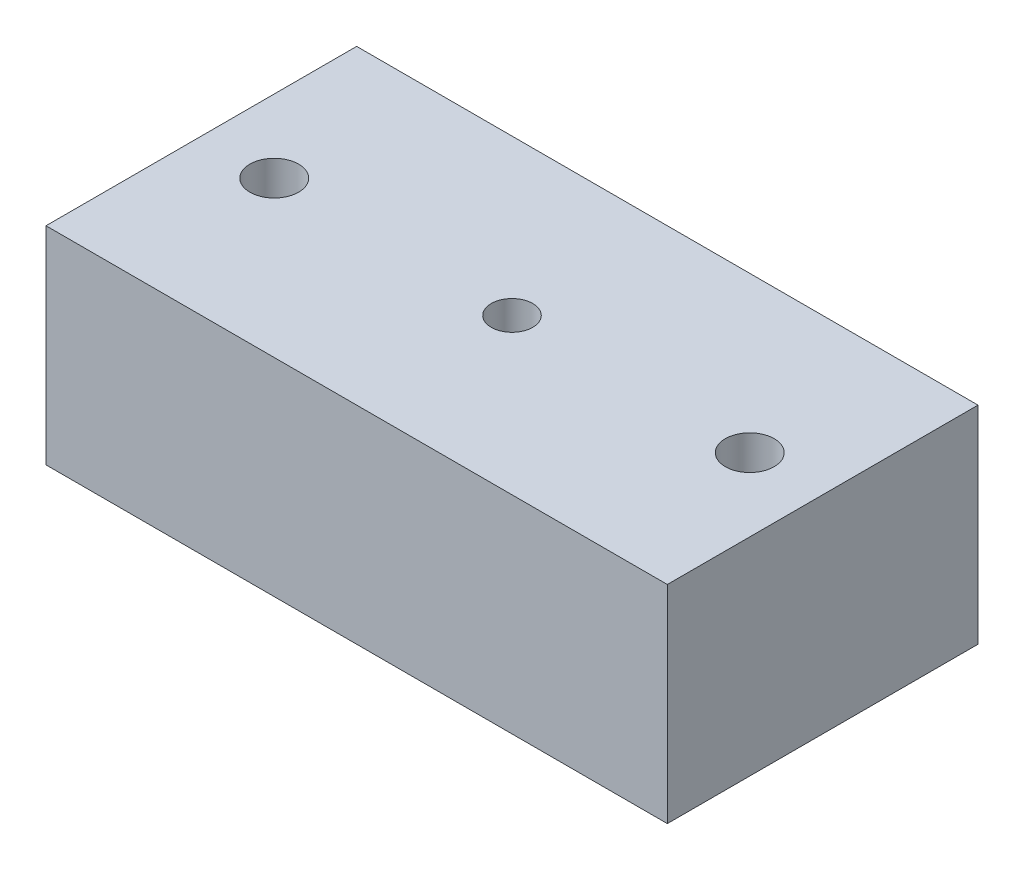
ISO-10303-21;
HEADER;
FILE_DESCRIPTION(('STEP AP214'),'2;1');
FILE_NAME('part.step','',(''),(''),'','','');
FILE_SCHEMA(('AUTOMOTIVE_DESIGN { 1 0 10303 214 1 1 1 1 }'));
ENDSEC;
DATA;
#1=APPLICATION_CONTEXT('core data for automotive mechanical design processes');
#2=APPLICATION_PROTOCOL_DEFINITION('international standard','automotive_design',2000,#1);
#3=PRODUCT_CONTEXT('',#1,'mechanical');
#4=PRODUCT('Part','Part','',(#3));
#5=PRODUCT_RELATED_PRODUCT_CATEGORY('part','',(#4));
#6=PRODUCT_DEFINITION_FORMATION('','',#4);
#7=PRODUCT_DEFINITION_CONTEXT('part definition',#1,'design');
#8=PRODUCT_DEFINITION('design','',#6,#7);
#9=PRODUCT_DEFINITION_SHAPE('','',#8);
#10=(LENGTH_UNIT() NAMED_UNIT(*) SI_UNIT(.MILLI.,.METRE.));
#11=(NAMED_UNIT(*) PLANE_ANGLE_UNIT() SI_UNIT($,.RADIAN.));
#12=(NAMED_UNIT(*) SI_UNIT($,.STERADIAN.) SOLID_ANGLE_UNIT());
#13=UNCERTAINTY_MEASURE_WITH_UNIT(LENGTH_MEASURE(1.E-05),#10,'distance_accuracy_value','');
#14=(GEOMETRIC_REPRESENTATION_CONTEXT(3) GLOBAL_UNCERTAINTY_ASSIGNED_CONTEXT((#13)) GLOBAL_UNIT_ASSIGNED_CONTEXT((#10,
#11,#12)) REPRESENTATION_CONTEXT('',''));
#15=CARTESIAN_POINT('',(0.,0.,0.));
#16=DIRECTION('',(0.,0.,1.));
#17=DIRECTION('',(1.,0.,0.));
#18=AXIS2_PLACEMENT_3D('',#15,#16,#17);
#19=CARTESIAN_POINT('',(0.,40.,0.));
#20=DIRECTION('',(0.,-1.,0.));
#21=DIRECTION('',(0.,0.,-1.));
#22=AXIS2_PLACEMENT_3D('',#19,#20,#21);
#23=PLANE('',#22);
#24=DIRECTION('',(0.,0.,-1.));
#25=VECTOR('',#24,1.);
#26=CARTESIAN_POINT('',(60.,40.,30.));
#27=LINE('',#26,#25);
#28=CARTESIAN_POINT('',(60.,40.,30.));
#29=VERTEX_POINT('',#28);
#30=CARTESIAN_POINT('',(60.,40.,-30.));
#31=VERTEX_POINT('',#30);
#32=EDGE_CURVE('E90',#29,#31,#27,.T.);
#33=ORIENTED_EDGE('',*,*,#32,.T.);
#34=DIRECTION('',(-1.,0.,0.));
#35=VECTOR('',#34,1.);
#36=CARTESIAN_POINT('',(-60.,40.,-30.));
#37=LINE('',#36,#35);
#38=CARTESIAN_POINT('',(-60.,40.,-30.));
#39=VERTEX_POINT('',#38);
#40=EDGE_CURVE('E85',#31,#39,#37,.T.);
#41=ORIENTED_EDGE('',*,*,#40,.T.);
#42=DIRECTION('',(0.,0.,1.));
#43=VECTOR('',#42,1.);
#44=CARTESIAN_POINT('',(-60.,40.,30.));
#45=LINE('',#44,#43);
#46=CARTESIAN_POINT('',(-60.,40.,30.));
#47=VERTEX_POINT('',#46);
#48=EDGE_CURVE('E88',#39,#47,#45,.T.);
#49=ORIENTED_EDGE('',*,*,#48,.T.);
#50=DIRECTION('',(1.,0.,0.));
#51=VECTOR('',#50,1.);
#52=CARTESIAN_POINT('',(-60.,40.,30.));
#53=LINE('',#52,#51);
#54=EDGE_CURVE('E55',#47,#29,#53,.T.);
#55=ORIENTED_EDGE('',*,*,#54,.T.);
#56=EDGE_LOOP('',(#33,#41,#49,#55));
#57=FACE_BOUND('',#56,.T.);
#58=CARTESIAN_POINT('',(0.,40.,0.));
#59=DIRECTION('',(0.,1.,0.));
#60=DIRECTION('',(0.,0.,1.));
#61=AXIS2_PLACEMENT_3D('',#58,#59,#60);
#62=CIRCLE('',#61,4.);
#63=CARTESIAN_POINT('',(0.,40.,4.));
#64=VERTEX_POINT('',#63);
#65=EDGE_CURVE('E105',#64,#64,#62,.T.);
#66=ORIENTED_EDGE('',*,*,#65,.F.);
#67=EDGE_LOOP('',(#66));
#68=FACE_BOUND('',#67,.T.);
#69=CARTESIAN_POINT('',(-45.9178121612938,40.,0.));
#70=DIRECTION('',(0.,1.,0.));
#71=DIRECTION('',(0.,0.,1.));
#72=AXIS2_PLACEMENT_3D('',#69,#70,#71);
#73=CIRCLE('',#72,4.70558735217259);
#74=CARTESIAN_POINT('',(-45.9178121612938,40.,4.70558735217259));
#75=VERTEX_POINT('',#74);
#76=EDGE_CURVE('E120',#75,#75,#73,.T.);
#77=ORIENTED_EDGE('',*,*,#76,.F.);
#78=EDGE_LOOP('',(#77));
#79=FACE_BOUND('',#78,.T.);
#80=CARTESIAN_POINT('',(45.9178121612938,40.,0.));
#81=DIRECTION('',(0.,1.,0.));
#82=DIRECTION('',(0.,0.,-1.));
#83=AXIS2_PLACEMENT_3D('',#80,#81,#82);
#84=CIRCLE('',#83,4.70558735217259);
#85=CARTESIAN_POINT('',(45.9178121612938,40.,-4.70558735217259));
#86=VERTEX_POINT('',#85);
#87=EDGE_CURVE('E126',#86,#86,#84,.T.);
#88=ORIENTED_EDGE('',*,*,#87,.F.);
#89=EDGE_LOOP('',(#88));
#90=FACE_BOUND('',#89,.T.);
#91=ADVANCED_FACE('F38',(#57,#68,#79,#90),#23,.F.);
#92=CARTESIAN_POINT('',(0.,0.,0.));
#93=DIRECTION('',(0.,-1.,0.));
#94=DIRECTION('',(0.,0.,-1.));
#95=AXIS2_PLACEMENT_3D('',#92,#93,#94);
#96=PLANE('',#95);
#97=CARTESIAN_POINT('',(-45.9178121612938,0.,0.));
#98=DIRECTION('',(0.,1.,0.));
#99=DIRECTION('',(0.,0.,1.));
#100=AXIS2_PLACEMENT_3D('',#97,#98,#99);
#101=CIRCLE('',#100,4.70558735217259);
#102=CARTESIAN_POINT('',(-45.9178121612938,0.,4.70558735217259));
#103=VERTEX_POINT('',#102);
#104=EDGE_CURVE('E123',#103,#103,#101,.T.);
#105=ORIENTED_EDGE('',*,*,#104,.T.);
#106=EDGE_LOOP('',(#105));
#107=FACE_BOUND('',#106,.T.);
#108=DIRECTION('',(0.,0.,-1.));
#109=VECTOR('',#108,1.);
#110=CARTESIAN_POINT('',(60.,0.,30.));
#111=LINE('',#110,#109);
#112=CARTESIAN_POINT('',(60.,0.,30.));
#113=VERTEX_POINT('',#112);
#114=CARTESIAN_POINT('',(60.,0.,-30.));
#115=VERTEX_POINT('',#114);
#116=EDGE_CURVE('E102',#113,#115,#111,.T.);
#117=ORIENTED_EDGE('',*,*,#116,.F.);
#118=DIRECTION('',(1.,0.,0.));
#119=VECTOR('',#118,1.);
#120=CARTESIAN_POINT('',(-60.,0.,30.));
#121=LINE('',#120,#119);
#122=CARTESIAN_POINT('',(-60.,0.,30.));
#123=VERTEX_POINT('',#122);
#124=EDGE_CURVE('E78',#123,#113,#121,.T.);
#125=ORIENTED_EDGE('',*,*,#124,.F.);
#126=DIRECTION('',(0.,0.,1.));
#127=VECTOR('',#126,1.);
#128=CARTESIAN_POINT('',(-60.,0.,30.));
#129=LINE('',#128,#127);
#130=CARTESIAN_POINT('',(-60.,0.,-30.));
#131=VERTEX_POINT('',#130);
#132=EDGE_CURVE('E72',#131,#123,#129,.T.);
#133=ORIENTED_EDGE('',*,*,#132,.F.);
#134=DIRECTION('',(-1.,0.,0.));
#135=VECTOR('',#134,1.);
#136=CARTESIAN_POINT('',(-60.,0.,-30.));
#137=LINE('',#136,#135);
#138=EDGE_CURVE('E94',#115,#131,#137,.T.);
#139=ORIENTED_EDGE('',*,*,#138,.F.);
#140=EDGE_LOOP('',(#117,#125,#133,#139));
#141=FACE_BOUND('',#140,.T.);
#142=CARTESIAN_POINT('',(0.,0.,0.));
#143=DIRECTION('',(0.,1.,0.));
#144=DIRECTION('',(0.,0.,1.));
#145=AXIS2_PLACEMENT_3D('',#142,#143,#144);
#146=CIRCLE('',#145,4.);
#147=CARTESIAN_POINT('',(0.,0.,4.));
#148=VERTEX_POINT('',#147);
#149=EDGE_CURVE('E117',#148,#148,#146,.T.);
#150=ORIENTED_EDGE('',*,*,#149,.T.);
#151=EDGE_LOOP('',(#150));
#152=FACE_BOUND('',#151,.T.);
#153=CARTESIAN_POINT('',(45.9178121612938,0.,0.));
#154=DIRECTION('',(0.,1.,0.));
#155=DIRECTION('',(0.,0.,-1.));
#156=AXIS2_PLACEMENT_3D('',#153,#154,#155);
#157=CIRCLE('',#156,4.70558735217259);
#158=CARTESIAN_POINT('',(45.9178121612938,0.,-4.70558735217259));
#159=VERTEX_POINT('',#158);
#160=EDGE_CURVE('E129',#159,#159,#157,.T.);
#161=ORIENTED_EDGE('',*,*,#160,.T.);
#162=EDGE_LOOP('',(#161));
#163=FACE_BOUND('',#162,.T.);
#164=ADVANCED_FACE('F113',(#107,#141,#152,#163),#96,.T.);
#165=CARTESIAN_POINT('',(60.,40.,30.));
#166=DIRECTION('',(-1.,0.,0.));
#167=DIRECTION('',(0.,0.,1.));
#168=AXIS2_PLACEMENT_3D('',#165,#166,#167);
#169=PLANE('',#168);
#170=ORIENTED_EDGE('',*,*,#116,.T.);
#171=DIRECTION('',(0.,-1.,0.));
#172=VECTOR('',#171,1.);
#173=CARTESIAN_POINT('',(60.,40.,-30.));
#174=LINE('',#173,#172);
#175=EDGE_CURVE('E11',#31,#115,#174,.T.);
#176=ORIENTED_EDGE('',*,*,#175,.F.);
#177=ORIENTED_EDGE('',*,*,#32,.F.);
#178=DIRECTION('',(0.,-1.,0.));
#179=VECTOR('',#178,1.);
#180=CARTESIAN_POINT('',(60.,40.,30.));
#181=LINE('',#180,#179);
#182=EDGE_CURVE('E98',#29,#113,#181,.T.);
#183=ORIENTED_EDGE('',*,*,#182,.T.);
#184=EDGE_LOOP('',(#170,#176,#177,#183));
#185=FACE_BOUND('',#184,.T.);
#186=ADVANCED_FACE('F40',(#185),#169,.F.);
#187=CARTESIAN_POINT('',(-60.,40.,-30.));
#188=DIRECTION('',(0.,0.,1.));
#189=DIRECTION('',(1.,0.,0.));
#190=AXIS2_PLACEMENT_3D('',#187,#188,#189);
#191=PLANE('',#190);
#192=ORIENTED_EDGE('',*,*,#138,.T.);
#193=DIRECTION('',(0.,-1.,0.));
#194=VECTOR('',#193,1.);
#195=CARTESIAN_POINT('',(-60.,40.,-30.));
#196=LINE('',#195,#194);
#197=EDGE_CURVE('E47',#39,#131,#196,.T.);
#198=ORIENTED_EDGE('',*,*,#197,.F.);
#199=ORIENTED_EDGE('',*,*,#40,.F.);
#200=ORIENTED_EDGE('',*,*,#175,.T.);
#201=EDGE_LOOP('',(#192,#198,#199,#200));
#202=FACE_BOUND('',#201,.T.);
#203=ADVANCED_FACE('F93',(#202),#191,.F.);
#204=CARTESIAN_POINT('',(-60.,40.,30.));
#205=DIRECTION('',(1.,0.,0.));
#206=DIRECTION('',(0.,0.,-1.));
#207=AXIS2_PLACEMENT_3D('',#204,#205,#206);
#208=PLANE('',#207);
#209=ORIENTED_EDGE('',*,*,#132,.T.);
#210=DIRECTION('',(0.,-1.,0.));
#211=VECTOR('',#210,1.);
#212=CARTESIAN_POINT('',(-60.,40.,30.));
#213=LINE('',#212,#211);
#214=EDGE_CURVE('E95',#47,#123,#213,.T.);
#215=ORIENTED_EDGE('',*,*,#214,.F.);
#216=ORIENTED_EDGE('',*,*,#48,.F.);
#217=ORIENTED_EDGE('',*,*,#197,.T.);
#218=EDGE_LOOP('',(#209,#215,#216,#217));
#219=FACE_BOUND('',#218,.T.);
#220=ADVANCED_FACE('F96',(#219),#208,.F.);
#221=CARTESIAN_POINT('',(-60.,40.,30.));
#222=DIRECTION('',(0.,0.,-1.));
#223=DIRECTION('',(-1.,0.,0.));
#224=AXIS2_PLACEMENT_3D('',#221,#222,#223);
#225=PLANE('',#224);
#226=ORIENTED_EDGE('',*,*,#124,.T.);
#227=ORIENTED_EDGE('',*,*,#182,.F.);
#228=ORIENTED_EDGE('',*,*,#54,.F.);
#229=ORIENTED_EDGE('',*,*,#214,.T.);
#230=EDGE_LOOP('',(#226,#227,#228,#229));
#231=FACE_BOUND('',#230,.T.);
#232=ADVANCED_FACE('F110',(#231),#225,.F.);
#233=CARTESIAN_POINT('',(0.,40.,0.));
#234=DIRECTION('',(0.,-1.,0.));
#235=DIRECTION('',(0.,0.,-1.));
#236=AXIS2_PLACEMENT_3D('',#233,#234,#235);
#237=CYLINDRICAL_SURFACE('',#236,4.);
#238=ORIENTED_EDGE('',*,*,#65,.T.);
#239=EDGE_LOOP('',(#238));
#240=FACE_BOUND('',#239,.T.);
#241=ORIENTED_EDGE('',*,*,#149,.F.);
#242=EDGE_LOOP('',(#241));
#243=FACE_BOUND('',#242,.T.);
#244=ADVANCED_FACE('F146',(#240,#243),#237,.F.);
#245=CARTESIAN_POINT('',(-45.9178121612938,40.,0.));
#246=DIRECTION('',(0.,-1.,0.));
#247=DIRECTION('',(0.,0.,-1.));
#248=AXIS2_PLACEMENT_3D('',#245,#246,#247);
#249=CYLINDRICAL_SURFACE('',#248,4.70558735217259);
#250=ORIENTED_EDGE('',*,*,#76,.T.);
#251=EDGE_LOOP('',(#250));
#252=FACE_BOUND('',#251,.T.);
#253=ORIENTED_EDGE('',*,*,#104,.F.);
#254=EDGE_LOOP('',(#253));
#255=FACE_BOUND('',#254,.T.);
#256=ADVANCED_FACE('F192',(#252,#255),#249,.F.);
#257=CARTESIAN_POINT('',(45.9178121612938,40.,0.));
#258=DIRECTION('',(0.,-1.,0.));
#259=DIRECTION('',(0.,0.,-1.));
#260=AXIS2_PLACEMENT_3D('',#257,#258,#259);
#261=CYLINDRICAL_SURFACE('',#260,4.70558735217259);
#262=ORIENTED_EDGE('',*,*,#87,.T.);
#263=EDGE_LOOP('',(#262));
#264=FACE_BOUND('',#263,.T.);
#265=ORIENTED_EDGE('',*,*,#160,.F.);
#266=EDGE_LOOP('',(#265));
#267=FACE_BOUND('',#266,.T.);
#268=ADVANCED_FACE('F135',(#264,#267),#261,.F.);
#269=CLOSED_SHELL('',(#91,#164,#186,#203,#220,#232,#244,#256,#268));
#270=MANIFOLD_SOLID_BREP('B2',#269);
#271=ADVANCED_BREP_SHAPE_REPRESENTATION('',(#18,#270),#14);
#272=SHAPE_DEFINITION_REPRESENTATION(#9,#271);
ENDSEC;
END-ISO-10303-21;
